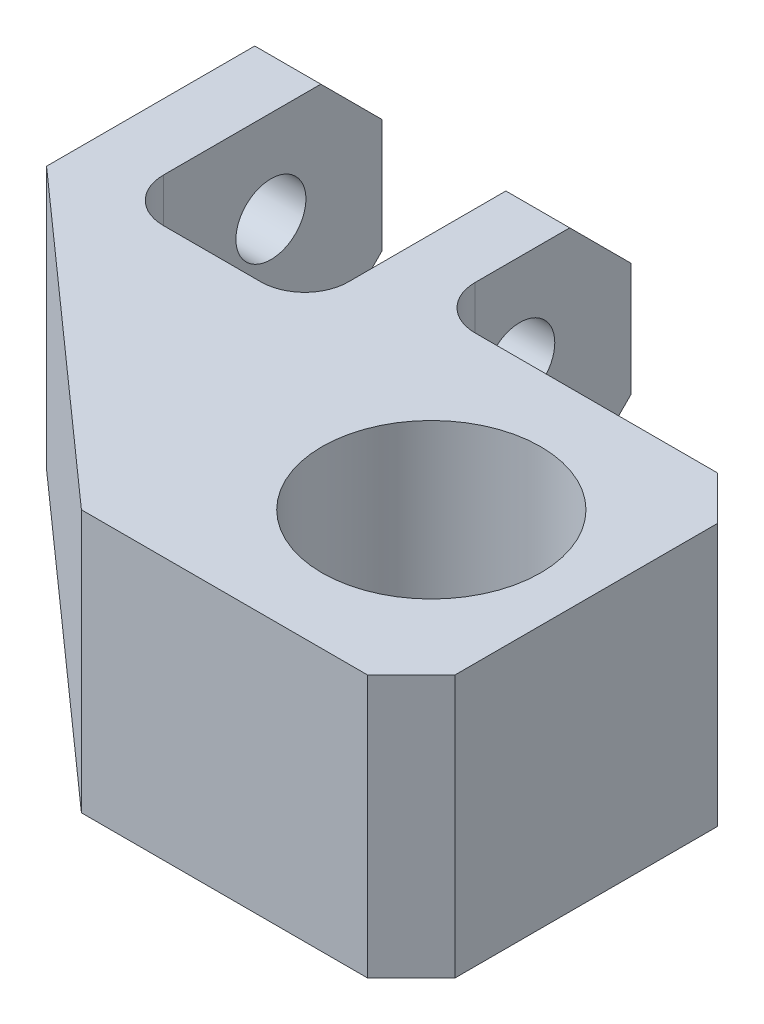
ISO-10303-21;
HEADER;
FILE_DESCRIPTION(('STEP AP214'),'2;1');
FILE_NAME('part.step','',(''),(''),'','','');
FILE_SCHEMA(('AUTOMOTIVE_DESIGN { 1 0 10303 214 1 1 1 1 }'));
ENDSEC;
DATA;
#1=APPLICATION_CONTEXT('core data for automotive mechanical design processes');
#2=APPLICATION_PROTOCOL_DEFINITION('international standard','automotive_design',2000,#1);
#3=PRODUCT_CONTEXT('',#1,'mechanical');
#4=PRODUCT('Part','Part','',(#3));
#5=PRODUCT_RELATED_PRODUCT_CATEGORY('part','',(#4));
#6=PRODUCT_DEFINITION_FORMATION('','',#4);
#7=PRODUCT_DEFINITION_CONTEXT('part definition',#1,'design');
#8=PRODUCT_DEFINITION('design','',#6,#7);
#9=PRODUCT_DEFINITION_SHAPE('','',#8);
#10=(LENGTH_UNIT() NAMED_UNIT(*) SI_UNIT(.MILLI.,.METRE.));
#11=(NAMED_UNIT(*) PLANE_ANGLE_UNIT() SI_UNIT($,.RADIAN.));
#12=(NAMED_UNIT(*) SI_UNIT($,.STERADIAN.) SOLID_ANGLE_UNIT());
#13=UNCERTAINTY_MEASURE_WITH_UNIT(LENGTH_MEASURE(1.E-05),#10,'distance_accuracy_value','');
#14=(GEOMETRIC_REPRESENTATION_CONTEXT(3) GLOBAL_UNCERTAINTY_ASSIGNED_CONTEXT((#13)) GLOBAL_UNIT_ASSIGNED_CONTEXT((#10,
#11,#12)) REPRESENTATION_CONTEXT('',''));
#15=CARTESIAN_POINT('',(0.,0.,0.));
#16=DIRECTION('',(0.,0.,1.));
#17=DIRECTION('',(1.,0.,0.));
#18=AXIS2_PLACEMENT_3D('',#15,#16,#17);
#19=CARTESIAN_POINT('',(-20.,30.,-42.8153068542372));
#20=DIRECTION('',(0.,0.,-1.));
#21=DIRECTION('',(-1.,0.,0.));
#22=AXIS2_PLACEMENT_3D('',#19,#20,#21);
#23=PLANE('',#22);
#24=DIRECTION('',(0.,-1.,0.));
#25=VECTOR('',#24,1.);
#26=CARTESIAN_POINT('',(-20.,30.,-42.8153068542372));
#27=LINE('',#26,#25);
#28=CARTESIAN_POINT('',(-20.,23.,-42.8153068542372));
#29=VERTEX_POINT('',#28);
#30=CARTESIAN_POINT('',(-20.,10.,-42.8153068542372));
#31=VERTEX_POINT('',#30);
#32=EDGE_CURVE('E321',#29,#31,#27,.T.);
#33=ORIENTED_EDGE('',*,*,#32,.T.);
#34=DIRECTION('',(-1.,0.,0.));
#35=VECTOR('',#34,1.);
#36=CARTESIAN_POINT('',(-27.2970818182395,10.,-42.8153068542372));
#37=LINE('',#36,#35);
#38=CARTESIAN_POINT('',(-27.2970818182395,10.,-42.8153068542372));
#39=VERTEX_POINT('',#38);
#40=EDGE_CURVE('E224',#31,#39,#37,.T.);
#41=ORIENTED_EDGE('',*,*,#40,.T.);
#42=DIRECTION('',(0.,-1.,0.));
#43=VECTOR('',#42,1.);
#44=CARTESIAN_POINT('',(-27.2970818182395,30.,-42.8153068542372));
#45=LINE('',#44,#43);
#46=CARTESIAN_POINT('',(-27.2970818182395,23.,-42.8153068542372));
#47=VERTEX_POINT('',#46);
#48=EDGE_CURVE('E250',#47,#39,#45,.T.);
#49=ORIENTED_EDGE('',*,*,#48,.F.);
#50=DIRECTION('',(1.,0.,0.));
#51=VECTOR('',#50,1.);
#52=CARTESIAN_POINT('',(-20.,23.,-42.8153068542372));
#53=LINE('',#52,#51);
#54=EDGE_CURVE('E286',#47,#29,#53,.T.);
#55=ORIENTED_EDGE('',*,*,#54,.T.);
#56=EDGE_LOOP('',(#33,#41,#49,#55));
#57=FACE_BOUND('',#56,.T.);
#58=ADVANCED_FACE('F31',(#57),#23,.T.);
#59=CARTESIAN_POINT('',(-20.,30.,20.));
#60=DIRECTION('',(0.,1.,0.));
#61=DIRECTION('',(0.,0.,1.));
#62=AXIS2_PLACEMENT_3D('',#59,#60,#61);
#63=PLANE('',#62);
#64=DIRECTION('',(0.,0.,-1.));
#65=VECTOR('',#64,1.);
#66=CARTESIAN_POINT('',(17.703662967798,30.,-20.));
#67=LINE('',#66,#65);
#68=CARTESIAN_POINT('',(17.703662967798,30.,15.));
#69=VERTEX_POINT('',#68);
#70=CARTESIAN_POINT('',(17.703662967798,30.,-15.));
#71=VERTEX_POINT('',#70);
#72=EDGE_CURVE('E410',#69,#71,#67,.T.);
#73=ORIENTED_EDGE('',*,*,#72,.T.);
#74=DIRECTION('',(0.707106781186547,0.,0.707106781186549));
#75=VECTOR('',#74,1.);
#76=CARTESIAN_POINT('',(16.3518314838991,30.,-16.351831483899));
#77=LINE('',#76,#75);
#78=CARTESIAN_POINT('',(12.703662967798,30.,-20.));
#79=VERTEX_POINT('',#78);
#80=EDGE_CURVE('E39',#71,#79,#77,.F.);
#81=ORIENTED_EDGE('',*,*,#80,.T.);
#82=DIRECTION('',(-1.,0.,0.));
#83=VECTOR('',#82,1.);
#84=CARTESIAN_POINT('',(-20.,30.,-20.));
#85=LINE('',#84,#83);
#86=CARTESIAN_POINT('',(-15.,30.,-20.));
#87=VERTEX_POINT('',#86);
#88=EDGE_CURVE('E240',#79,#87,#85,.T.);
#89=ORIENTED_EDGE('',*,*,#88,.T.);
#90=CARTESIAN_POINT('',(-15.,30.,-25.));
#91=DIRECTION('',(0.,1.,0.));
#92=DIRECTION('',(0.,0.,1.));
#93=AXIS2_PLACEMENT_3D('',#90,#91,#92);
#94=CIRCLE('',#93,5.);
#95=CARTESIAN_POINT('',(-20.,30.,-25.));
#96=VERTEX_POINT('',#95);
#97=EDGE_CURVE('E219',#87,#96,#94,.F.);
#98=ORIENTED_EDGE('',*,*,#97,.T.);
#99=DIRECTION('',(0.,0.,1.));
#100=VECTOR('',#99,1.);
#101=CARTESIAN_POINT('',(-20.,30.,20.));
#102=LINE('',#101,#100);
#103=CARTESIAN_POINT('',(-20.,30.,-35.8153068542371));
#104=VERTEX_POINT('',#103);
#105=EDGE_CURVE('E196',#104,#96,#102,.T.);
#106=ORIENTED_EDGE('',*,*,#105,.F.);
#107=DIRECTION('',(-1.,0.,0.));
#108=VECTOR('',#107,1.);
#109=CARTESIAN_POINT('',(-20.,30.,-35.8153068542371));
#110=LINE('',#109,#108);
#111=CARTESIAN_POINT('',(-27.2970818182395,30.,-35.8153068542371));
#112=VERTEX_POINT('',#111);
#113=EDGE_CURVE('E280',#104,#112,#110,.T.);
#114=ORIENTED_EDGE('',*,*,#113,.T.);
#115=DIRECTION('',(0.,0.,-1.));
#116=VECTOR('',#115,1.);
#117=CARTESIAN_POINT('',(-27.2970818182395,30.,20.));
#118=LINE('',#117,#116);
#119=CARTESIAN_POINT('',(-27.2970818182395,30.,-17.8153068542372));
#120=VERTEX_POINT('',#119);
#121=EDGE_CURVE('E337',#120,#112,#118,.T.);
#122=ORIENTED_EDGE('',*,*,#121,.F.);
#123=CARTESIAN_POINT('',(-32.2970818182395,30.,-17.8153068542372));
#124=DIRECTION('',(0.,1.,0.));
#125=DIRECTION('',(0.,0.,1.));
#126=AXIS2_PLACEMENT_3D('',#123,#124,#125);
#127=CIRCLE('',#126,5.);
#128=CARTESIAN_POINT('',(-32.2970818182395,30.,-12.8153068542372));
#129=VERTEX_POINT('',#128);
#130=EDGE_CURVE('E274',#120,#129,#127,.F.);
#131=ORIENTED_EDGE('',*,*,#130,.T.);
#132=DIRECTION('',(-1.,0.,0.));
#133=VECTOR('',#132,1.);
#134=CARTESIAN_POINT('',(-20.,30.,-12.8153068542372));
#135=LINE('',#134,#133);
#136=CARTESIAN_POINT('',(-43.4486378494812,30.,-12.8153068542372));
#137=VERTEX_POINT('',#136);
#138=EDGE_CURVE('E212',#129,#137,#135,.T.);
#139=ORIENTED_EDGE('',*,*,#138,.T.);
#140=CARTESIAN_POINT('',(-43.4486378494812,30.,-17.8153068542372));
#141=DIRECTION('',(0.,1.,0.));
#142=DIRECTION('',(0.,0.,1.));
#143=AXIS2_PLACEMENT_3D('',#140,#141,#142);
#144=CIRCLE('',#143,5.);
#145=CARTESIAN_POINT('',(-48.4486378494812,30.,-17.8153068542372));
#146=VERTEX_POINT('',#145);
#147=EDGE_CURVE('E267',#137,#146,#144,.F.);
#148=ORIENTED_EDGE('',*,*,#147,.T.);
#149=DIRECTION('',(0.,0.,1.));
#150=VECTOR('',#149,1.);
#151=CARTESIAN_POINT('',(-48.4486378494812,30.,20.));
#152=LINE('',#151,#150);
#153=CARTESIAN_POINT('',(-48.4486378494812,30.,-35.8153068542372));
#154=VERTEX_POINT('',#153);
#155=EDGE_CURVE('E338',#154,#146,#152,.T.);
#156=ORIENTED_EDGE('',*,*,#155,.F.);
#157=DIRECTION('',(-1.,0.,0.));
#158=VECTOR('',#157,1.);
#159=CARTESIAN_POINT('',(-20.,30.,-35.8153068542372));
#160=LINE('',#159,#158);
#161=CARTESIAN_POINT('',(-56.,30.,-35.8153068542372));
#162=VERTEX_POINT('',#161);
#163=EDGE_CURVE('E190',#154,#162,#160,.T.);
#164=ORIENTED_EDGE('',*,*,#163,.T.);
#165=DIRECTION('',(0.,0.,-1.));
#166=VECTOR('',#165,1.);
#167=CARTESIAN_POINT('',(-56.,30.,-12.0136716039183));
#168=LINE('',#167,#166);
#169=CARTESIAN_POINT('',(-56.,30.,-12.0136716039183));
#170=VERTEX_POINT('',#169);
#171=EDGE_CURVE('E173',#170,#162,#168,.T.);
#172=ORIENTED_EDGE('',*,*,#171,.F.);
#173=DIRECTION('',(-0.747268386596631,0.,-0.664522353569289));
#174=VECTOR('',#173,1.);
#175=CARTESIAN_POINT('',(-20.,30.,20.));
#176=LINE('',#175,#174);
#177=CARTESIAN_POINT('',(-20.,30.,20.));
#178=VERTEX_POINT('',#177);
#179=EDGE_CURVE('E187',#178,#170,#176,.T.);
#180=ORIENTED_EDGE('',*,*,#179,.F.);
#181=DIRECTION('',(1.,0.,0.));
#182=VECTOR('',#181,1.);
#183=CARTESIAN_POINT('',(-20.,30.,20.));
#184=LINE('',#183,#182);
#185=CARTESIAN_POINT('',(12.703662967798,30.,20.));
#186=VERTEX_POINT('',#185);
#187=EDGE_CURVE('E238',#178,#186,#184,.T.);
#188=ORIENTED_EDGE('',*,*,#187,.T.);
#189=DIRECTION('',(-0.707106781186549,0.,0.707106781186547));
#190=VECTOR('',#189,1.);
#191=CARTESIAN_POINT('',(-3.64816851610104,30.,36.351831483899));
#192=LINE('',#191,#190);
#193=EDGE_CURVE('E423',#186,#69,#192,.F.);
#194=ORIENTED_EDGE('',*,*,#193,.T.);
#195=EDGE_LOOP('',(#73,#81,#89,#98,#106,#114,#122,#131,#139,#148,#156,#164,#172,#180,#188,#194));
#196=FACE_BOUND('',#195,.T.);
#197=CARTESIAN_POINT('',(0.,30.,0.));
#198=DIRECTION('',(0.,1.,0.));
#199=DIRECTION('',(0.,0.,1.));
#200=AXIS2_PLACEMENT_3D('',#197,#198,#199);
#201=CIRCLE('',#200,12.5);
#202=CARTESIAN_POINT('',(0.,30.,12.5));
#203=VERTEX_POINT('',#202);
#204=EDGE_CURVE('E403',#203,#203,#201,.T.);
#205=ORIENTED_EDGE('',*,*,#204,.F.);
#206=EDGE_LOOP('',(#205));
#207=FACE_BOUND('',#206,.T.);
#208=ADVANCED_FACE('F185',(#196,#207),#63,.T.);
#209=CARTESIAN_POINT('',(-20.,0.,20.));
#210=DIRECTION('',(0.,1.,0.));
#211=DIRECTION('',(0.,0.,1.));
#212=AXIS2_PLACEMENT_3D('',#209,#210,#211);
#213=PLANE('',#212);
#214=DIRECTION('',(-1.,0.,0.));
#215=VECTOR('',#214,1.);
#216=CARTESIAN_POINT('',(-20.,0.,-20.));
#217=LINE('',#216,#215);
#218=CARTESIAN_POINT('',(12.703662967798,0.,-20.));
#219=VERTEX_POINT('',#218);
#220=CARTESIAN_POINT('',(-15.,0.,-20.));
#221=VERTEX_POINT('',#220);
#222=EDGE_CURVE('E235',#219,#221,#217,.T.);
#223=ORIENTED_EDGE('',*,*,#222,.F.);
#224=DIRECTION('',(-0.707106781186547,0.,-0.707106781186549));
#225=VECTOR('',#224,1.);
#226=CARTESIAN_POINT('',(12.703662967798,0.,-20.));
#227=LINE('',#226,#225);
#228=CARTESIAN_POINT('',(17.703662967798,0.,-15.));
#229=VERTEX_POINT('',#228);
#230=EDGE_CURVE('E421',#219,#229,#227,.F.);
#231=ORIENTED_EDGE('',*,*,#230,.T.);
#232=DIRECTION('',(0.,0.,-1.));
#233=VECTOR('',#232,1.);
#234=CARTESIAN_POINT('',(17.703662967798,0.,-20.));
#235=LINE('',#234,#233);
#236=CARTESIAN_POINT('',(17.703662967798,0.,15.));
#237=VERTEX_POINT('',#236);
#238=EDGE_CURVE('E239',#237,#229,#235,.T.);
#239=ORIENTED_EDGE('',*,*,#238,.F.);
#240=DIRECTION('',(0.707106781186549,0.,-0.707106781186547));
#241=VECTOR('',#240,1.);
#242=CARTESIAN_POINT('',(17.703662967798,0.,15.));
#243=LINE('',#242,#241);
#244=CARTESIAN_POINT('',(12.703662967798,0.,20.));
#245=VERTEX_POINT('',#244);
#246=EDGE_CURVE('E430',#237,#245,#243,.F.);
#247=ORIENTED_EDGE('',*,*,#246,.T.);
#248=DIRECTION('',(1.,0.,0.));
#249=VECTOR('',#248,1.);
#250=CARTESIAN_POINT('',(-20.,0.,20.));
#251=LINE('',#250,#249);
#252=CARTESIAN_POINT('',(-20.,0.,20.));
#253=VERTEX_POINT('',#252);
#254=EDGE_CURVE('E406',#253,#245,#251,.T.);
#255=ORIENTED_EDGE('',*,*,#254,.F.);
#256=DIRECTION('',(-0.747268386596631,0.,-0.664522353569289));
#257=VECTOR('',#256,1.);
#258=CARTESIAN_POINT('',(-20.,0.,20.));
#259=LINE('',#258,#257);
#260=CARTESIAN_POINT('',(-56.,0.,-12.0136716039183));
#261=VERTEX_POINT('',#260);
#262=EDGE_CURVE('E206',#253,#261,#259,.T.);
#263=ORIENTED_EDGE('',*,*,#262,.T.);
#264=DIRECTION('',(0.,0.,-1.));
#265=VECTOR('',#264,1.);
#266=CARTESIAN_POINT('',(-56.,0.,-12.0136716039183));
#267=LINE('',#266,#265);
#268=CARTESIAN_POINT('',(-56.,0.,-32.8153068542372));
#269=VERTEX_POINT('',#268);
#270=EDGE_CURVE('E176',#261,#269,#267,.T.);
#271=ORIENTED_EDGE('',*,*,#270,.T.);
#272=DIRECTION('',(1.,0.,0.));
#273=VECTOR('',#272,1.);
#274=CARTESIAN_POINT('',(-48.4486378494812,0.,-32.8153068542372));
#275=LINE('',#274,#273);
#276=CARTESIAN_POINT('',(-48.4486378494812,0.,-32.8153068542372));
#277=VERTEX_POINT('',#276);
#278=EDGE_CURVE('E215',#269,#277,#275,.T.);
#279=ORIENTED_EDGE('',*,*,#278,.T.);
#280=DIRECTION('',(0.,0.,1.));
#281=VECTOR('',#280,1.);
#282=CARTESIAN_POINT('',(-48.4486378494812,0.,20.));
#283=LINE('',#282,#281);
#284=CARTESIAN_POINT('',(-48.4486378494812,0.,-17.8153068542372));
#285=VERTEX_POINT('',#284);
#286=EDGE_CURVE('E342',#277,#285,#283,.T.);
#287=ORIENTED_EDGE('',*,*,#286,.T.);
#288=CARTESIAN_POINT('',(-43.4486378494812,0.,-17.8153068542372));
#289=DIRECTION('',(0.,1.,0.));
#290=DIRECTION('',(0.,0.,1.));
#291=AXIS2_PLACEMENT_3D('',#288,#289,#290);
#292=CIRCLE('',#291,5.);
#293=CARTESIAN_POINT('',(-43.4486378494812,0.,-12.8153068542372));
#294=VERTEX_POINT('',#293);
#295=EDGE_CURVE('E270',#285,#294,#292,.T.);
#296=ORIENTED_EDGE('',*,*,#295,.T.);
#297=DIRECTION('',(-1.,0.,0.));
#298=VECTOR('',#297,1.);
#299=CARTESIAN_POINT('',(-20.,0.,-12.8153068542372));
#300=LINE('',#299,#298);
#301=CARTESIAN_POINT('',(-32.2970818182395,0.,-12.8153068542372));
#302=VERTEX_POINT('',#301);
#303=EDGE_CURVE('E253',#302,#294,#300,.T.);
#304=ORIENTED_EDGE('',*,*,#303,.F.);
#305=CARTESIAN_POINT('',(-32.2970818182395,0.,-17.8153068542372));
#306=DIRECTION('',(0.,1.,0.));
#307=DIRECTION('',(0.,0.,1.));
#308=AXIS2_PLACEMENT_3D('',#305,#306,#307);
#309=CIRCLE('',#308,5.);
#310=CARTESIAN_POINT('',(-27.2970818182395,0.,-17.8153068542372));
#311=VERTEX_POINT('',#310);
#312=EDGE_CURVE('E272',#302,#311,#309,.T.);
#313=ORIENTED_EDGE('',*,*,#312,.T.);
#314=DIRECTION('',(0.,0.,-1.));
#315=VECTOR('',#314,1.);
#316=CARTESIAN_POINT('',(-27.2970818182395,0.,20.));
#317=LINE('',#316,#315);
#318=CARTESIAN_POINT('',(-27.2970818182395,0.,-32.8153068542372));
#319=VERTEX_POINT('',#318);
#320=EDGE_CURVE('E334',#311,#319,#317,.T.);
#321=ORIENTED_EDGE('',*,*,#320,.T.);
#322=DIRECTION('',(1.,0.,0.));
#323=VECTOR('',#322,1.);
#324=CARTESIAN_POINT('',(-20.,0.,-32.8153068542372));
#325=LINE('',#324,#323);
#326=CARTESIAN_POINT('',(-20.,0.,-32.8153068542372));
#327=VERTEX_POINT('',#326);
#328=EDGE_CURVE('E218',#319,#327,#325,.T.);
#329=ORIENTED_EDGE('',*,*,#328,.T.);
#330=DIRECTION('',(0.,0.,1.));
#331=VECTOR('',#330,1.);
#332=CARTESIAN_POINT('',(-20.,0.,20.));
#333=LINE('',#332,#331);
#334=CARTESIAN_POINT('',(-20.,0.,-25.));
#335=VERTEX_POINT('',#334);
#336=EDGE_CURVE('E209',#327,#335,#333,.T.);
#337=ORIENTED_EDGE('',*,*,#336,.T.);
#338=CARTESIAN_POINT('',(-15.,0.,-25.));
#339=DIRECTION('',(0.,1.,0.));
#340=DIRECTION('',(0.,0.,1.));
#341=AXIS2_PLACEMENT_3D('',#338,#339,#340);
#342=CIRCLE('',#341,5.);
#343=EDGE_CURVE('E299',#335,#221,#342,.T.);
#344=ORIENTED_EDGE('',*,*,#343,.T.);
#345=EDGE_LOOP('',(#223,#231,#239,#247,#255,#263,#271,#279,#287,#296,#304,#313,#321,#329,#337,#344));
#346=FACE_BOUND('',#345,.T.);
#347=CARTESIAN_POINT('',(0.,0.,0.));
#348=DIRECTION('',(0.,1.,0.));
#349=DIRECTION('',(0.,0.,1.));
#350=AXIS2_PLACEMENT_3D('',#347,#348,#349);
#351=CIRCLE('',#350,12.5);
#352=CARTESIAN_POINT('',(0.,0.,12.5));
#353=VERTEX_POINT('',#352);
#354=EDGE_CURVE('E327',#353,#353,#351,.T.);
#355=ORIENTED_EDGE('',*,*,#354,.T.);
#356=EDGE_LOOP('',(#355));
#357=FACE_BOUND('',#356,.T.);
#358=ADVANCED_FACE('F316',(#346,#357),#213,.F.);
#359=CARTESIAN_POINT('',(-20.,30.,20.));
#360=DIRECTION('',(0.,0.,-1.));
#361=DIRECTION('',(-1.,0.,0.));
#362=AXIS2_PLACEMENT_3D('',#359,#360,#361);
#363=PLANE('',#362);
#364=ORIENTED_EDGE('',*,*,#254,.T.);
#365=DIRECTION('',(0.,1.,0.));
#366=VECTOR('',#365,1.);
#367=CARTESIAN_POINT('',(12.703662967798,30.,20.));
#368=LINE('',#367,#366);
#369=EDGE_CURVE('E11',#245,#186,#368,.T.);
#370=ORIENTED_EDGE('',*,*,#369,.T.);
#371=ORIENTED_EDGE('',*,*,#187,.F.);
#372=DIRECTION('',(0.,-1.,0.));
#373=VECTOR('',#372,1.);
#374=CARTESIAN_POINT('',(-20.,30.,20.));
#375=LINE('',#374,#373);
#376=EDGE_CURVE('E195',#178,#253,#375,.T.);
#377=ORIENTED_EDGE('',*,*,#376,.T.);
#378=EDGE_LOOP('',(#364,#370,#371,#377));
#379=FACE_BOUND('',#378,.T.);
#380=ADVANCED_FACE('F433',(#379),#363,.F.);
#381=CARTESIAN_POINT('',(17.703662967798,30.,-20.));
#382=DIRECTION('',(-1.,0.,0.));
#383=DIRECTION('',(0.,0.,1.));
#384=AXIS2_PLACEMENT_3D('',#381,#382,#383);
#385=PLANE('',#384);
#386=ORIENTED_EDGE('',*,*,#238,.T.);
#387=DIRECTION('',(0.,1.,0.));
#388=VECTOR('',#387,1.);
#389=CARTESIAN_POINT('',(17.703662967798,30.,-15.));
#390=LINE('',#389,#388);
#391=EDGE_CURVE('E52',#229,#71,#390,.T.);
#392=ORIENTED_EDGE('',*,*,#391,.T.);
#393=ORIENTED_EDGE('',*,*,#72,.F.);
#394=DIRECTION('',(0.,-1.,0.));
#395=VECTOR('',#394,1.);
#396=CARTESIAN_POINT('',(17.703662967798,30.,15.));
#397=LINE('',#396,#395);
#398=EDGE_CURVE('E416',#69,#237,#397,.T.);
#399=ORIENTED_EDGE('',*,*,#398,.T.);
#400=EDGE_LOOP('',(#386,#392,#393,#399));
#401=FACE_BOUND('',#400,.T.);
#402=ADVANCED_FACE('F414',(#401),#385,.F.);
#403=CARTESIAN_POINT('',(-20.,30.,-20.));
#404=DIRECTION('',(0.,0.,1.));
#405=DIRECTION('',(1.,0.,0.));
#406=AXIS2_PLACEMENT_3D('',#403,#404,#405);
#407=PLANE('',#406);
#408=ORIENTED_EDGE('',*,*,#88,.F.);
#409=DIRECTION('',(0.,-1.,0.));
#410=VECTOR('',#409,1.);
#411=CARTESIAN_POINT('',(12.703662967798,30.,-20.));
#412=LINE('',#411,#410);
#413=EDGE_CURVE('E234',#79,#219,#412,.T.);
#414=ORIENTED_EDGE('',*,*,#413,.T.);
#415=ORIENTED_EDGE('',*,*,#222,.T.);
#416=DIRECTION('',(0.,-1.,0.));
#417=VECTOR('',#416,1.);
#418=CARTESIAN_POINT('',(-15.,30.,-20.));
#419=LINE('',#418,#417);
#420=EDGE_CURVE('E296',#221,#87,#419,.F.);
#421=ORIENTED_EDGE('',*,*,#420,.T.);
#422=EDGE_LOOP('',(#408,#414,#415,#421));
#423=FACE_BOUND('',#422,.T.);
#424=ADVANCED_FACE('F429',(#423),#407,.F.);
#425=CARTESIAN_POINT('',(0.,30.,0.));
#426=DIRECTION('',(0.,-1.,0.));
#427=DIRECTION('',(0.,0.,-1.));
#428=AXIS2_PLACEMENT_3D('',#425,#426,#427);
#429=CYLINDRICAL_SURFACE('',#428,12.5);
#430=ORIENTED_EDGE('',*,*,#204,.T.);
#431=EDGE_LOOP('',(#430));
#432=FACE_BOUND('',#431,.T.);
#433=ORIENTED_EDGE('',*,*,#354,.F.);
#434=EDGE_LOOP('',(#433));
#435=FACE_BOUND('',#434,.T.);
#436=ADVANCED_FACE('F387',(#432,#435),#429,.F.);
#437=CARTESIAN_POINT('',(-20.,30.,20.));
#438=DIRECTION('',(1.,0.,0.));
#439=DIRECTION('',(0.,0.,-1.));
#440=AXIS2_PLACEMENT_3D('',#437,#438,#439);
#441=PLANE('',#440);
#442=CARTESIAN_POINT('',(-20.,19.4845415162906,-30.1098767224753));
#443=DIRECTION('',(1.,0.,0.));
#444=DIRECTION('',(0.,0.,-1.));
#445=AXIS2_PLACEMENT_3D('',#442,#443,#444);
#446=CIRCLE('',#445,4.00000000062004);
#447=CARTESIAN_POINT('',(-20.,19.4845415162906,-34.1098767230953));
#448=VERTEX_POINT('',#447);
#449=EDGE_CURVE('E471',#448,#448,#446,.T.);
#450=ORIENTED_EDGE('',*,*,#449,.F.);
#451=EDGE_LOOP('',(#450));
#452=FACE_BOUND('',#451,.T.);
#453=ORIENTED_EDGE('',*,*,#336,.F.);
#454=DIRECTION('',(0.,0.707106781186549,-0.707106781186547));
#455=VECTOR('',#454,1.);
#456=CARTESIAN_POINT('',(-20.,-11.4076534271186,-21.4076534271187));
#457=LINE('',#456,#455);
#458=EDGE_CURVE('E222',#327,#31,#457,.T.);
#459=ORIENTED_EDGE('',*,*,#458,.T.);
#460=ORIENTED_EDGE('',*,*,#32,.F.);
#461=DIRECTION('',(0.,-0.707106781186546,-0.707106781186549));
#462=VECTOR('',#461,1.);
#463=CARTESIAN_POINT('',(-20.,57.9076534271186,-7.90765342711846));
#464=LINE('',#463,#462);
#465=EDGE_CURVE('E289',#29,#104,#464,.F.);
#466=ORIENTED_EDGE('',*,*,#465,.T.);
#467=ORIENTED_EDGE('',*,*,#105,.T.);
#468=DIRECTION('',(0.,-1.,0.));
#469=VECTOR('',#468,1.);
#470=CARTESIAN_POINT('',(-20.,30.,-25.));
#471=LINE('',#470,#469);
#472=EDGE_CURVE('E293',#96,#335,#471,.T.);
#473=ORIENTED_EDGE('',*,*,#472,.T.);
#474=EDGE_LOOP('',(#453,#459,#460,#466,#467,#473));
#475=FACE_BOUND('',#474,.T.);
#476=ADVANCED_FACE('F310',(#452,#475),#441,.T.);
#477=DIRECTION('',(0.,1.,0.));
#478=VECTOR('',#477,1.);
#479=CARTESIAN_POINT('',(-48.4486378494812,30.,-42.8153068542372));
#480=LINE('',#479,#478);
#481=CARTESIAN_POINT('',(-48.4486378494812,10.,-42.8153068542372));
#482=VERTEX_POINT('',#481);
#483=CARTESIAN_POINT('',(-48.4486378494812,23.,-42.8153068542372));
#484=VERTEX_POINT('',#483);
#485=EDGE_CURVE('E248',#482,#484,#480,.T.);
#486=ORIENTED_EDGE('',*,*,#485,.F.);
#487=DIRECTION('',(-1.,0.,0.));
#488=VECTOR('',#487,1.);
#489=CARTESIAN_POINT('',(-56.,10.,-42.8153068542372));
#490=LINE('',#489,#488);
#491=CARTESIAN_POINT('',(-56.,10.,-42.8153068542372));
#492=VERTEX_POINT('',#491);
#493=EDGE_CURVE('E230',#482,#492,#490,.T.);
#494=ORIENTED_EDGE('',*,*,#493,.T.);
#495=DIRECTION('',(0.,-1.,0.));
#496=VECTOR('',#495,1.);
#497=CARTESIAN_POINT('',(-56.,30.,-42.8153068542372));
#498=LINE('',#497,#496);
#499=CARTESIAN_POINT('',(-56.,23.,-42.8153068542372));
#500=VERTEX_POINT('',#499);
#501=EDGE_CURVE('E181',#500,#492,#498,.T.);
#502=ORIENTED_EDGE('',*,*,#501,.F.);
#503=DIRECTION('',(1.,0.,0.));
#504=VECTOR('',#503,1.);
#505=CARTESIAN_POINT('',(-20.,23.,-42.8153068542372));
#506=LINE('',#505,#504);
#507=EDGE_CURVE('E276',#500,#484,#506,.T.);
#508=ORIENTED_EDGE('',*,*,#507,.T.);
#509=EDGE_LOOP('',(#486,#494,#502,#508));
#510=FACE_BOUND('',#509,.T.);
#511=ADVANCED_FACE('F372',(#510),#23,.T.);
#512=CARTESIAN_POINT('',(-56.,30.,-12.0136716039183));
#513=DIRECTION('',(-1.,0.,0.));
#514=DIRECTION('',(0.,0.,1.));
#515=AXIS2_PLACEMENT_3D('',#512,#513,#514);
#516=PLANE('',#515);
#517=CARTESIAN_POINT('',(-56.,19.4845415162906,-30.1098767224753));
#518=DIRECTION('',(-1.,0.,0.));
#519=DIRECTION('',(0.,0.,1.));
#520=AXIS2_PLACEMENT_3D('',#517,#518,#519);
#521=CIRCLE('',#520,4.00000000062004);
#522=CARTESIAN_POINT('',(-56.,19.4845415162906,-26.1098767218552));
#523=VERTEX_POINT('',#522);
#524=EDGE_CURVE('E475',#523,#523,#521,.T.);
#525=ORIENTED_EDGE('',*,*,#524,.F.);
#526=EDGE_LOOP('',(#525));
#527=FACE_BOUND('',#526,.T.);
#528=ORIENTED_EDGE('',*,*,#501,.T.);
#529=DIRECTION('',(0.,-0.707106781186549,0.707106781186547));
#530=VECTOR('',#529,1.);
#531=CARTESIAN_POINT('',(-56.,4.59918237484059,-37.4144892290778));
#532=LINE('',#531,#530);
#533=EDGE_CURVE('E232',#492,#269,#532,.T.);
#534=ORIENTED_EDGE('',*,*,#533,.T.);
#535=ORIENTED_EDGE('',*,*,#270,.F.);
#536=DIRECTION('',(0.,-1.,0.));
#537=VECTOR('',#536,1.);
#538=CARTESIAN_POINT('',(-56.,30.,-12.0136716039183));
#539=LINE('',#538,#537);
#540=EDGE_CURVE('E169',#170,#261,#539,.T.);
#541=ORIENTED_EDGE('',*,*,#540,.F.);
#542=ORIENTED_EDGE('',*,*,#171,.T.);
#543=DIRECTION('',(0.,0.707106781186546,0.707106781186549));
#544=VECTOR('',#543,1.);
#545=CARTESIAN_POINT('',(-56.,41.9008176251594,-23.9144892290777));
#546=LINE('',#545,#544);
#547=EDGE_CURVE('E284',#162,#500,#546,.F.);
#548=ORIENTED_EDGE('',*,*,#547,.T.);
#549=EDGE_LOOP('',(#528,#534,#535,#541,#542,#548));
#550=FACE_BOUND('',#549,.T.);
#551=ADVANCED_FACE('F172',(#527,#550),#516,.T.);
#552=CARTESIAN_POINT('',(-20.,30.,20.));
#553=DIRECTION('',(-0.664522353569289,0.,0.747268386596631));
#554=DIRECTION('',(0.747268386596631,0.,0.664522353569289));
#555=AXIS2_PLACEMENT_3D('',#552,#553,#554);
#556=PLANE('',#555);
#557=ORIENTED_EDGE('',*,*,#262,.F.);
#558=ORIENTED_EDGE('',*,*,#376,.F.);
#559=ORIENTED_EDGE('',*,*,#179,.T.);
#560=ORIENTED_EDGE('',*,*,#540,.T.);
#561=EDGE_LOOP('',(#557,#558,#559,#560));
#562=FACE_BOUND('',#561,.T.);
#563=ADVANCED_FACE('F193',(#562),#556,.T.);
#564=CARTESIAN_POINT('',(-27.2970818182395,-3.13007693893608,-12.8153068542372));
#565=DIRECTION('',(0.,0.,-1.));
#566=DIRECTION('',(-1.,0.,0.));
#567=AXIS2_PLACEMENT_3D('',#564,#565,#566);
#568=PLANE('',#567);
#569=ORIENTED_EDGE('',*,*,#303,.T.);
#570=DIRECTION('',(0.,1.,0.));
#571=VECTOR('',#570,1.);
#572=CARTESIAN_POINT('',(-43.4486378494812,-3.13007693893608,-12.8153068542372));
#573=LINE('',#572,#571);
#574=EDGE_CURVE('E259',#294,#137,#573,.T.);
#575=ORIENTED_EDGE('',*,*,#574,.T.);
#576=ORIENTED_EDGE('',*,*,#138,.F.);
#577=DIRECTION('',(0.,-1.,0.));
#578=VECTOR('',#577,1.);
#579=CARTESIAN_POINT('',(-32.2970818182395,-3.13007693893608,-12.8153068542372));
#580=LINE('',#579,#578);
#581=EDGE_CURVE('E256',#129,#302,#580,.T.);
#582=ORIENTED_EDGE('',*,*,#581,.T.);
#583=EDGE_LOOP('',(#569,#575,#576,#582));
#584=FACE_BOUND('',#583,.T.);
#585=ADVANCED_FACE('F352',(#584),#568,.T.);
#586=CARTESIAN_POINT('',(-27.2970818182395,30.4304072605923,-12.8153068542372));
#587=DIRECTION('',(1.,0.,0.));
#588=DIRECTION('',(0.,0.,-1.));
#589=AXIS2_PLACEMENT_3D('',#586,#587,#588);
#590=PLANE('',#589);
#591=CARTESIAN_POINT('',(-27.2970818182395,19.4845415162906,-30.1098767224753));
#592=DIRECTION('',(1.,0.,0.));
#593=DIRECTION('',(0.,0.,-1.));
#594=AXIS2_PLACEMENT_3D('',#591,#592,#593);
#595=CIRCLE('',#594,4.00000000062004);
#596=CARTESIAN_POINT('',(-27.2970818182395,19.4845415162906,-34.1098767230953));
#597=VERTEX_POINT('',#596);
#598=EDGE_CURVE('E470',#597,#597,#595,.T.);
#599=ORIENTED_EDGE('',*,*,#598,.T.);
#600=EDGE_LOOP('',(#599));
#601=FACE_BOUND('',#600,.T.);
#602=ORIENTED_EDGE('',*,*,#48,.T.);
#603=DIRECTION('',(0.,-0.707106781186549,0.707106781186547));
#604=VECTOR('',#603,1.);
#605=CARTESIAN_POINT('',(-27.2970818182395,0.,-32.8153068542372));
#606=LINE('',#605,#604);
#607=EDGE_CURVE('E226',#39,#319,#606,.T.);
#608=ORIENTED_EDGE('',*,*,#607,.T.);
#609=ORIENTED_EDGE('',*,*,#320,.F.);
#610=DIRECTION('',(0.,-1.,0.));
#611=VECTOR('',#610,1.);
#612=CARTESIAN_POINT('',(-27.2970818182395,30.4304072605923,-17.8153068542372));
#613=LINE('',#612,#611);
#614=EDGE_CURVE('E265',#311,#120,#613,.F.);
#615=ORIENTED_EDGE('',*,*,#614,.T.);
#616=ORIENTED_EDGE('',*,*,#121,.T.);
#617=DIRECTION('',(0.,0.707106781186546,0.707106781186549));
#618=VECTOR('',#617,1.);
#619=CARTESIAN_POINT('',(-27.2970818182395,23.,-42.8153068542372));
#620=LINE('',#619,#618);
#621=EDGE_CURVE('E291',#112,#47,#620,.F.);
#622=ORIENTED_EDGE('',*,*,#621,.T.);
#623=EDGE_LOOP('',(#602,#608,#609,#615,#616,#622));
#624=FACE_BOUND('',#623,.T.);
#625=ADVANCED_FACE('F333',(#601,#624),#590,.F.);
#626=CARTESIAN_POINT('',(-48.4486378494812,30.4304072605923,-12.8153068542372));
#627=DIRECTION('',(-1.,0.,0.));
#628=DIRECTION('',(0.,0.,1.));
#629=AXIS2_PLACEMENT_3D('',#626,#627,#628);
#630=PLANE('',#629);
#631=CARTESIAN_POINT('',(-48.4486378494812,19.4845415162906,-30.1098767224753));
#632=DIRECTION('',(-1.,0.,0.));
#633=DIRECTION('',(0.,0.,1.));
#634=AXIS2_PLACEMENT_3D('',#631,#632,#633);
#635=CIRCLE('',#634,4.00000000062004);
#636=CARTESIAN_POINT('',(-48.4486378494812,19.4845415162906,-26.1098767218552));
#637=VERTEX_POINT('',#636);
#638=EDGE_CURVE('E213',#637,#637,#635,.T.);
#639=ORIENTED_EDGE('',*,*,#638,.T.);
#640=EDGE_LOOP('',(#639));
#641=FACE_BOUND('',#640,.T.);
#642=ORIENTED_EDGE('',*,*,#286,.F.);
#643=DIRECTION('',(0.,0.707106781186549,-0.707106781186547));
#644=VECTOR('',#643,1.);
#645=CARTESIAN_POINT('',(-48.4486378494812,0.,-32.8153068542372));
#646=LINE('',#645,#644);
#647=EDGE_CURVE('E228',#277,#482,#646,.T.);
#648=ORIENTED_EDGE('',*,*,#647,.T.);
#649=ORIENTED_EDGE('',*,*,#485,.T.);
#650=DIRECTION('',(0.,-0.707106781186546,-0.707106781186549));
#651=VECTOR('',#650,1.);
#652=CARTESIAN_POINT('',(-48.4486378494812,23.,-42.8153068542372));
#653=LINE('',#652,#651);
#654=EDGE_CURVE('E279',#484,#154,#653,.F.);
#655=ORIENTED_EDGE('',*,*,#654,.T.);
#656=ORIENTED_EDGE('',*,*,#155,.T.);
#657=DIRECTION('',(0.,1.,0.));
#658=VECTOR('',#657,1.);
#659=CARTESIAN_POINT('',(-48.4486378494812,30.4304072605923,-17.8153068542372));
#660=LINE('',#659,#658);
#661=EDGE_CURVE('E262',#146,#285,#660,.F.);
#662=ORIENTED_EDGE('',*,*,#661,.T.);
#663=EDGE_LOOP('',(#642,#648,#649,#655,#656,#662));
#664=FACE_BOUND('',#663,.T.);
#665=ADVANCED_FACE('F460',(#641,#664),#630,.F.);
#666=CARTESIAN_POINT('',(-43.4486378494812,-3.13007693893608,-17.8153068542372));
#667=DIRECTION('',(0.,1.,0.));
#668=DIRECTION('',(0.,0.,1.));
#669=AXIS2_PLACEMENT_3D('',#666,#667,#668);
#670=CYLINDRICAL_SURFACE('',#669,5.);
#671=ORIENTED_EDGE('',*,*,#295,.F.);
#672=ORIENTED_EDGE('',*,*,#661,.F.);
#673=ORIENTED_EDGE('',*,*,#147,.F.);
#674=ORIENTED_EDGE('',*,*,#574,.F.);
#675=EDGE_LOOP('',(#671,#672,#673,#674));
#676=FACE_BOUND('',#675,.T.);
#677=ADVANCED_FACE('F462',(#676),#670,.F.);
#678=CARTESIAN_POINT('',(-32.2970818182395,-3.13007693893608,-17.8153068542372));
#679=DIRECTION('',(0.,-1.,0.));
#680=DIRECTION('',(0.,0.,-1.));
#681=AXIS2_PLACEMENT_3D('',#678,#679,#680);
#682=CYLINDRICAL_SURFACE('',#681,5.);
#683=ORIENTED_EDGE('',*,*,#130,.F.);
#684=ORIENTED_EDGE('',*,*,#614,.F.);
#685=ORIENTED_EDGE('',*,*,#312,.F.);
#686=ORIENTED_EDGE('',*,*,#581,.F.);
#687=EDGE_LOOP('',(#683,#684,#685,#686));
#688=FACE_BOUND('',#687,.T.);
#689=ADVANCED_FACE('F355',(#688),#682,.F.);
#690=CARTESIAN_POINT('',(-20.,23.,-42.8153068542372));
#691=DIRECTION('',(0.,-0.707106781186549,0.707106781186546));
#692=DIRECTION('',(0.,-0.707106781186546,-0.707106781186549));
#693=AXIS2_PLACEMENT_3D('',#690,#691,#692);
#694=PLANE('',#693);
#695=ORIENTED_EDGE('',*,*,#547,.F.);
#696=ORIENTED_EDGE('',*,*,#163,.F.);
#697=ORIENTED_EDGE('',*,*,#654,.F.);
#698=ORIENTED_EDGE('',*,*,#507,.F.);
#699=EDGE_LOOP('',(#695,#696,#697,#698));
#700=FACE_BOUND('',#699,.T.);
#701=ADVANCED_FACE('F360',(#700),#694,.F.);
#702=CARTESIAN_POINT('',(-20.,23.,-42.8153068542372));
#703=DIRECTION('',(0.,-0.707106781186549,0.707106781186546));
#704=DIRECTION('',(0.,-0.707106781186546,-0.707106781186549));
#705=AXIS2_PLACEMENT_3D('',#702,#703,#704);
#706=PLANE('',#705);
#707=ORIENTED_EDGE('',*,*,#621,.F.);
#708=ORIENTED_EDGE('',*,*,#113,.F.);
#709=ORIENTED_EDGE('',*,*,#465,.F.);
#710=ORIENTED_EDGE('',*,*,#54,.F.);
#711=EDGE_LOOP('',(#707,#708,#709,#710));
#712=FACE_BOUND('',#711,.T.);
#713=ADVANCED_FACE('F358',(#712),#706,.F.);
#714=CARTESIAN_POINT('',(-15.,30.,-25.));
#715=DIRECTION('',(0.,-1.,0.));
#716=DIRECTION('',(0.,0.,-1.));
#717=AXIS2_PLACEMENT_3D('',#714,#715,#716);
#718=CYLINDRICAL_SURFACE('',#717,5.);
#719=ORIENTED_EDGE('',*,*,#97,.F.);
#720=ORIENTED_EDGE('',*,*,#420,.F.);
#721=ORIENTED_EDGE('',*,*,#343,.F.);
#722=ORIENTED_EDGE('',*,*,#472,.F.);
#723=EDGE_LOOP('',(#719,#720,#721,#722));
#724=FACE_BOUND('',#723,.T.);
#725=ADVANCED_FACE('F313',(#724),#718,.F.);
#726=CARTESIAN_POINT('',(17.703662967798,19.4845415162906,-30.1098767224753));
#727=DIRECTION('',(-1.,0.,0.));
#728=DIRECTION('',(0.,0.,1.));
#729=AXIS2_PLACEMENT_3D('',#726,#727,#728);
#730=CYLINDRICAL_SURFACE('',#729,4.00000000062004);
#731=ORIENTED_EDGE('',*,*,#524,.T.);
#732=EDGE_LOOP('',(#731));
#733=FACE_BOUND('',#732,.T.);
#734=ORIENTED_EDGE('',*,*,#638,.F.);
#735=EDGE_LOOP('',(#734));
#736=FACE_BOUND('',#735,.T.);
#737=ADVANCED_FACE('F366',(#733,#736),#730,.F.);
#738=ORIENTED_EDGE('',*,*,#449,.T.);
#739=EDGE_LOOP('',(#738));
#740=FACE_BOUND('',#739,.T.);
#741=ORIENTED_EDGE('',*,*,#598,.F.);
#742=EDGE_LOOP('',(#741));
#743=FACE_BOUND('',#742,.T.);
#744=ADVANCED_FACE('F445',(#740,#743),#730,.F.);
#745=CARTESIAN_POINT('',(-20.,0.,-32.8153068542372));
#746=DIRECTION('',(0.,-0.707106781186547,-0.707106781186549));
#747=DIRECTION('',(0.,0.707106781186549,-0.707106781186547));
#748=AXIS2_PLACEMENT_3D('',#745,#746,#747);
#749=PLANE('',#748);
#750=ORIENTED_EDGE('',*,*,#607,.F.);
#751=ORIENTED_EDGE('',*,*,#40,.F.);
#752=ORIENTED_EDGE('',*,*,#458,.F.);
#753=ORIENTED_EDGE('',*,*,#328,.F.);
#754=EDGE_LOOP('',(#750,#751,#752,#753));
#755=FACE_BOUND('',#754,.T.);
#756=ADVANCED_FACE('F330',(#755),#749,.T.);
#757=CARTESIAN_POINT('',(-20.,0.,-32.8153068542372));
#758=DIRECTION('',(0.,-0.707106781186546,-0.707106781186548));
#759=DIRECTION('',(0.,0.707106781186549,-0.707106781186547));
#760=AXIS2_PLACEMENT_3D('',#757,#758,#759);
#761=PLANE('',#760);
#762=ORIENTED_EDGE('',*,*,#533,.F.);
#763=ORIENTED_EDGE('',*,*,#493,.F.);
#764=ORIENTED_EDGE('',*,*,#647,.F.);
#765=ORIENTED_EDGE('',*,*,#278,.F.);
#766=EDGE_LOOP('',(#762,#763,#764,#765));
#767=FACE_BOUND('',#766,.T.);
#768=ADVANCED_FACE('F398',(#767),#761,.T.);
#769=CARTESIAN_POINT('',(12.703662967798,30.,-20.));
#770=DIRECTION('',(-0.707106781186548,0.,0.707106781186546));
#771=DIRECTION('',(0.707106781186547,0.,0.707106781186549));
#772=AXIS2_PLACEMENT_3D('',#769,#770,#771);
#773=PLANE('',#772);
#774=ORIENTED_EDGE('',*,*,#80,.F.);
#775=ORIENTED_EDGE('',*,*,#391,.F.);
#776=ORIENTED_EDGE('',*,*,#230,.F.);
#777=ORIENTED_EDGE('',*,*,#413,.F.);
#778=EDGE_LOOP('',(#774,#775,#776,#777));
#779=FACE_BOUND('',#778,.T.);
#780=ADVANCED_FACE('F419',(#779),#773,.F.);
#781=CARTESIAN_POINT('',(17.703662967798,30.,15.));
#782=DIRECTION('',(-0.707106781186546,0.,-0.707106781186548));
#783=DIRECTION('',(-0.707106781186549,0.,0.707106781186547));
#784=AXIS2_PLACEMENT_3D('',#781,#782,#783);
#785=PLANE('',#784);
#786=ORIENTED_EDGE('',*,*,#193,.F.);
#787=ORIENTED_EDGE('',*,*,#369,.F.);
#788=ORIENTED_EDGE('',*,*,#246,.F.);
#789=ORIENTED_EDGE('',*,*,#398,.F.);
#790=EDGE_LOOP('',(#786,#787,#788,#789));
#791=FACE_BOUND('',#790,.T.);
#792=ADVANCED_FACE('F33',(#791),#785,.F.);
#793=CLOSED_SHELL('',(#58,#208,#358,#380,#402,#424,#436,#476,#511,#551,#563,#585,#625,#665,#677,
#689,#701,#713,#725,#737,#744,#756,#768,#780,#792));
#794=MANIFOLD_SOLID_BREP('B2',#793);
#795=ADVANCED_BREP_SHAPE_REPRESENTATION('',(#18,#794),#14);
#796=SHAPE_DEFINITION_REPRESENTATION(#9,#795);
ENDSEC;
END-ISO-10303-21;
